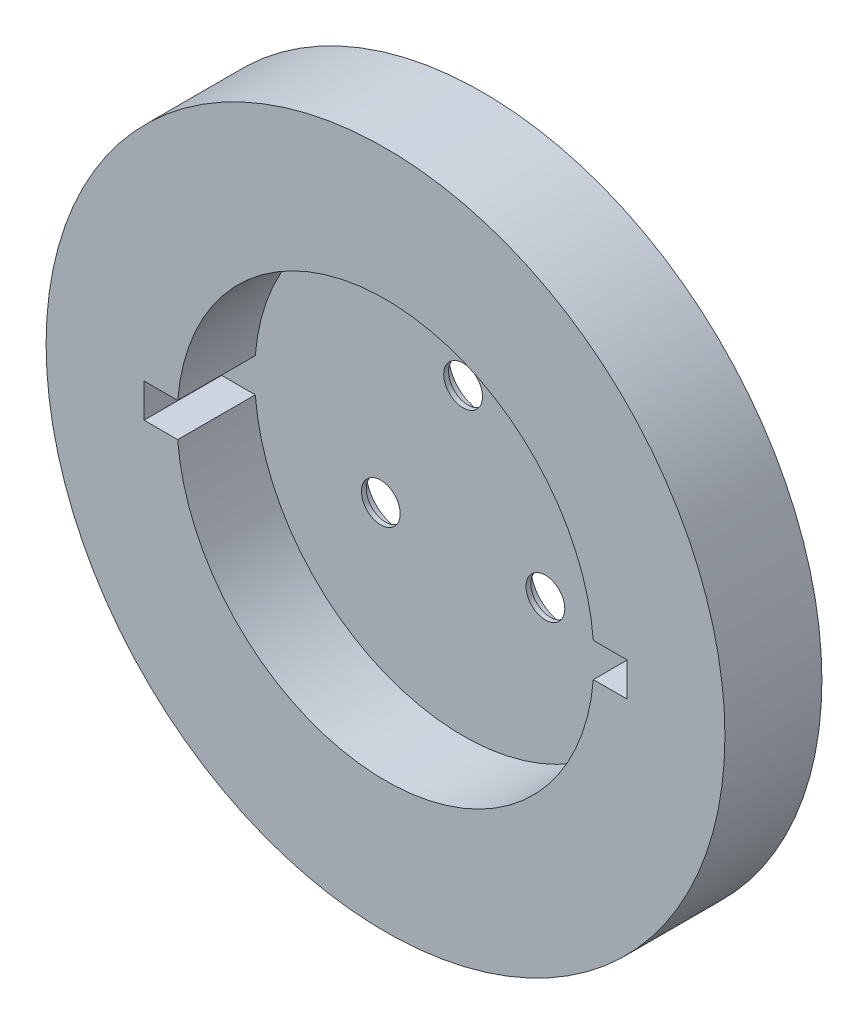
ISO-10303-21;
HEADER;
FILE_DESCRIPTION(('STEP AP214'),'2;1');
FILE_NAME('part.step','',(''),(''),'','','');
FILE_SCHEMA(('AUTOMOTIVE_DESIGN { 1 0 10303 214 1 1 1 1 }'));
ENDSEC;
DATA;
#1=APPLICATION_CONTEXT('core data for automotive mechanical design processes');
#2=APPLICATION_PROTOCOL_DEFINITION('international standard','automotive_design',2000,#1);
#3=PRODUCT_CONTEXT('',#1,'mechanical');
#4=PRODUCT('Part','Part','',(#3));
#5=PRODUCT_RELATED_PRODUCT_CATEGORY('part','',(#4));
#6=PRODUCT_DEFINITION_FORMATION('','',#4);
#7=PRODUCT_DEFINITION_CONTEXT('part definition',#1,'design');
#8=PRODUCT_DEFINITION('design','',#6,#7);
#9=PRODUCT_DEFINITION_SHAPE('','',#8);
#10=(LENGTH_UNIT() NAMED_UNIT(*) SI_UNIT(.MILLI.,.METRE.));
#11=(NAMED_UNIT(*) PLANE_ANGLE_UNIT() SI_UNIT($,.RADIAN.));
#12=(NAMED_UNIT(*) SI_UNIT($,.STERADIAN.) SOLID_ANGLE_UNIT());
#13=UNCERTAINTY_MEASURE_WITH_UNIT(LENGTH_MEASURE(1.E-05),#10,'distance_accuracy_value','');
#14=(GEOMETRIC_REPRESENTATION_CONTEXT(3) GLOBAL_UNCERTAINTY_ASSIGNED_CONTEXT((#13)) GLOBAL_UNIT_ASSIGNED_CONTEXT((#10,
#11,#12)) REPRESENTATION_CONTEXT('',''));
#15=CARTESIAN_POINT('',(0.,0.,0.));
#16=DIRECTION('',(0.,0.,1.));
#17=DIRECTION('',(1.,0.,0.));
#18=AXIS2_PLACEMENT_3D('',#15,#16,#17);
#19=CARTESIAN_POINT('',(0.,0.,10.));
#20=DIRECTION('',(0.,0.,1.));
#21=DIRECTION('',(1.,0.,0.));
#22=AXIS2_PLACEMENT_3D('',#19,#20,#21);
#23=PLANE('',#22);
#24=CARTESIAN_POINT('',(0.,0.,10.));
#25=DIRECTION('',(0.,0.,1.));
#26=DIRECTION('',(1.,0.,0.));
#27=AXIS2_PLACEMENT_3D('',#24,#25,#26);
#28=CIRCLE('',#27,35.);
#29=CARTESIAN_POINT('',(35.,0.,10.));
#30=VERTEX_POINT('',#29);
#31=EDGE_CURVE('E11',#30,#30,#28,.T.);
#32=ORIENTED_EDGE('',*,*,#31,.T.);
#33=EDGE_LOOP('',(#32));
#34=FACE_BOUND('',#33,.T.);
#35=DIRECTION('',(0.,1.,0.));
#36=VECTOR('',#35,1.);
#37=CARTESIAN_POINT('',(24.9,0.,10.));
#38=LINE('',#37,#36);
#39=CARTESIAN_POINT('',(24.9,-1.75,10.));
#40=VERTEX_POINT('',#39);
#41=CARTESIAN_POINT('',(24.9,1.75,10.));
#42=VERTEX_POINT('',#41);
#43=EDGE_CURVE('E145',#40,#42,#38,.T.);
#44=ORIENTED_EDGE('',*,*,#43,.F.);
#45=DIRECTION('',(-1.,0.,0.));
#46=VECTOR('',#45,1.);
#47=CARTESIAN_POINT('',(0.,-1.75,10.));
#48=LINE('',#47,#46);
#49=CARTESIAN_POINT('',(21.4286607140997,-1.75,10.));
#50=VERTEX_POINT('',#49);
#51=EDGE_CURVE('E57',#40,#50,#48,.T.);
#52=ORIENTED_EDGE('',*,*,#51,.T.);
#53=CARTESIAN_POINT('',(0.,0.,10.));
#54=DIRECTION('',(0.,0.,1.));
#55=DIRECTION('',(1.,0.,0.));
#56=AXIS2_PLACEMENT_3D('',#53,#54,#55);
#57=CIRCLE('',#56,21.5);
#58=CARTESIAN_POINT('',(-21.4286607140997,-1.75000000000067,10.));
#59=VERTEX_POINT('',#58);
#60=EDGE_CURVE('E159',#59,#50,#57,.T.);
#61=ORIENTED_EDGE('',*,*,#60,.F.);
#62=DIRECTION('',(1.,-2.43429726580597E-13,0.));
#63=VECTOR('',#62,1.);
#64=CARTESIAN_POINT('',(-4.26002021517478E-13,-1.75000000000589,10.));
#65=LINE('',#64,#63);
#66=CARTESIAN_POINT('',(-24.9,-1.74999999999983,10.));
#67=VERTEX_POINT('',#66);
#68=EDGE_CURVE('E165',#67,#59,#65,.T.);
#69=ORIENTED_EDGE('',*,*,#68,.F.);
#70=DIRECTION('',(4.97617819965918E-13,1.,0.));
#71=VECTOR('',#70,1.);
#72=CARTESIAN_POINT('',(-24.9,1.23906837171513E-11,10.));
#73=LINE('',#72,#71);
#74=CARTESIAN_POINT('',(-24.8999999999991,1.75000000000018,10.));
#75=VERTEX_POINT('',#74);
#76=EDGE_CURVE('E114',#67,#75,#73,.T.);
#77=ORIENTED_EDGE('',*,*,#76,.T.);
#78=DIRECTION('',(1.,-2.44241783661828E-13,0.));
#79=VECTOR('',#78,1.);
#80=CARTESIAN_POINT('',(4.27423121406757E-13,1.74999999999409,10.));
#81=LINE('',#80,#79);
#82=CARTESIAN_POINT('',(-21.4286607140993,1.74999999999937,10.));
#83=VERTEX_POINT('',#82);
#84=EDGE_CURVE('E158',#75,#83,#81,.T.);
#85=ORIENTED_EDGE('',*,*,#84,.T.);
#86=CARTESIAN_POINT('',(21.4286607140997,1.75,10.));
#87=VERTEX_POINT('',#86);
#88=EDGE_CURVE('E154',#87,#83,#57,.T.);
#89=ORIENTED_EDGE('',*,*,#88,.F.);
#90=DIRECTION('',(-1.,0.,0.));
#91=VECTOR('',#90,1.);
#92=CARTESIAN_POINT('',(0.,1.75,10.));
#93=LINE('',#92,#91);
#94=EDGE_CURVE('E150',#42,#87,#93,.T.);
#95=ORIENTED_EDGE('',*,*,#94,.F.);
#96=EDGE_LOOP('',(#44,#52,#61,#69,#77,#85,#89,#95));
#97=FACE_BOUND('',#96,.T.);
#98=ADVANCED_FACE('F39',(#34,#97),#23,.T.);
#99=CARTESIAN_POINT('',(0.,0.,10.));
#100=DIRECTION('',(0.,0.,-1.));
#101=DIRECTION('',(-1.,0.,0.));
#102=AXIS2_PLACEMENT_3D('',#99,#100,#101);
#103=CYLINDRICAL_SURFACE('',#102,35.);
#104=ORIENTED_EDGE('',*,*,#31,.F.);
#105=EDGE_LOOP('',(#104));
#106=FACE_BOUND('',#105,.T.);
#107=CARTESIAN_POINT('',(0.,0.,0.));
#108=DIRECTION('',(0.,0.,1.));
#109=DIRECTION('',(1.,0.,0.));
#110=AXIS2_PLACEMENT_3D('',#107,#108,#109);
#111=CIRCLE('',#110,35.);
#112=CARTESIAN_POINT('',(35.,0.,0.));
#113=VERTEX_POINT('',#112);
#114=EDGE_CURVE('E49',#113,#113,#111,.T.);
#115=ORIENTED_EDGE('',*,*,#114,.T.);
#116=EDGE_LOOP('',(#115));
#117=FACE_BOUND('',#116,.T.);
#118=ADVANCED_FACE('F41',(#106,#117),#103,.T.);
#119=CARTESIAN_POINT('',(0.,0.,0.));
#120=DIRECTION('',(0.,0.,1.));
#121=DIRECTION('',(1.,0.,0.));
#122=AXIS2_PLACEMENT_3D('',#119,#120,#121);
#123=PLANE('',#122);
#124=CARTESIAN_POINT('',(0.,9.8000000000006,0.));
#125=DIRECTION('',(0.,0.,-1.));
#126=DIRECTION('',(-1.,0.,0.));
#127=AXIS2_PLACEMENT_3D('',#124,#125,#126);
#128=CIRCLE('',#127,3.5);
#129=CARTESIAN_POINT('',(-3.5000000000001,9.8000000000006,0.));
#130=VERTEX_POINT('',#129);
#131=EDGE_CURVE('E246',#130,#130,#128,.T.);
#132=ORIENTED_EDGE('',*,*,#131,.F.);
#133=EDGE_LOOP('',(#132));
#134=FACE_BOUND('',#133,.T.);
#135=CARTESIAN_POINT('',(8.48704895708804,-4.90000000000026,0.));
#136=DIRECTION('',(0.,0.,-1.));
#137=DIRECTION('',(-1.,0.,0.));
#138=AXIS2_PLACEMENT_3D('',#135,#136,#137);
#139=CIRCLE('',#138,3.5);
#140=CARTESIAN_POINT('',(4.98704895708804,-4.90000000000026,0.));
#141=VERTEX_POINT('',#140);
#142=EDGE_CURVE('E210',#141,#141,#139,.T.);
#143=ORIENTED_EDGE('',*,*,#142,.F.);
#144=EDGE_LOOP('',(#143));
#145=FACE_BOUND('',#144,.T.);
#146=CARTESIAN_POINT('',(-8.48704895708802,-4.9000000000003,0.));
#147=DIRECTION('',(0.,0.,-1.));
#148=DIRECTION('',(-1.,0.,0.));
#149=AXIS2_PLACEMENT_3D('',#146,#147,#148);
#150=CIRCLE('',#149,3.5);
#151=CARTESIAN_POINT('',(-11.987048957088,-4.9000000000003,0.));
#152=VERTEX_POINT('',#151);
#153=EDGE_CURVE('E199',#152,#152,#150,.T.);
#154=ORIENTED_EDGE('',*,*,#153,.F.);
#155=EDGE_LOOP('',(#154));
#156=FACE_BOUND('',#155,.T.);
#157=ORIENTED_EDGE('',*,*,#114,.F.);
#158=EDGE_LOOP('',(#157));
#159=FACE_BOUND('',#158,.T.);
#160=ADVANCED_FACE('F287',(#134,#145,#156,#159),#123,.F.);
#161=CARTESIAN_POINT('',(0.,-1.75,2.));
#162=DIRECTION('',(0.,1.,0.));
#163=DIRECTION('',(0.,0.,1.));
#164=AXIS2_PLACEMENT_3D('',#161,#162,#163);
#165=PLANE('',#164);
#166=ORIENTED_EDGE('',*,*,#51,.F.);
#167=DIRECTION('',(0.,0.,1.));
#168=VECTOR('',#167,1.);
#169=CARTESIAN_POINT('',(24.9,-1.75,2.));
#170=LINE('',#169,#168);
#171=CARTESIAN_POINT('',(24.9,-1.75,2.));
#172=VERTEX_POINT('',#171);
#173=EDGE_CURVE('E93',#172,#40,#170,.T.);
#174=ORIENTED_EDGE('',*,*,#173,.F.);
#175=DIRECTION('',(-1.,0.,0.));
#176=VECTOR('',#175,1.);
#177=CARTESIAN_POINT('',(0.,-1.75,2.));
#178=LINE('',#177,#176);
#179=CARTESIAN_POINT('',(21.4286607140997,-1.75,2.));
#180=VERTEX_POINT('',#179);
#181=EDGE_CURVE('E63',#172,#180,#178,.T.);
#182=ORIENTED_EDGE('',*,*,#181,.T.);
#183=DIRECTION('',(0.,0.,1.));
#184=VECTOR('',#183,1.);
#185=CARTESIAN_POINT('',(21.4286607140997,-1.75,2.));
#186=LINE('',#185,#184);
#187=EDGE_CURVE('E89',#180,#50,#186,.T.);
#188=ORIENTED_EDGE('',*,*,#187,.T.);
#189=EDGE_LOOP('',(#166,#174,#182,#188));
#190=FACE_BOUND('',#189,.T.);
#191=ADVANCED_FACE('F290',(#190),#165,.T.);
#192=CARTESIAN_POINT('',(0.,0.,2.));
#193=DIRECTION('',(0.,0.,1.));
#194=DIRECTION('',(1.,0.,0.));
#195=AXIS2_PLACEMENT_3D('',#192,#193,#194);
#196=CYLINDRICAL_SURFACE('',#195,21.5);
#197=ORIENTED_EDGE('',*,*,#60,.T.);
#198=ORIENTED_EDGE('',*,*,#187,.F.);
#199=CARTESIAN_POINT('',(0.,0.,2.));
#200=DIRECTION('',(0.,0.,1.));
#201=DIRECTION('',(1.,0.,0.));
#202=AXIS2_PLACEMENT_3D('',#199,#200,#201);
#203=CIRCLE('',#202,21.5);
#204=CARTESIAN_POINT('',(-21.4286607140997,-1.75000000000067,2.));
#205=VERTEX_POINT('',#204);
#206=EDGE_CURVE('E136',#205,#180,#203,.T.);
#207=ORIENTED_EDGE('',*,*,#206,.F.);
#208=DIRECTION('',(0.,0.,1.));
#209=VECTOR('',#208,1.);
#210=CARTESIAN_POINT('',(-21.4286607140997,-1.75000000000067,2.));
#211=LINE('',#210,#209);
#212=EDGE_CURVE('E120',#205,#59,#211,.T.);
#213=ORIENTED_EDGE('',*,*,#212,.T.);
#214=EDGE_LOOP('',(#197,#198,#207,#213));
#215=FACE_BOUND('',#214,.T.);
#216=ADVANCED_FACE('F308',(#215),#196,.F.);
#217=CARTESIAN_POINT('',(-4.26002021517478E-13,-1.75000000000589,2.));
#218=DIRECTION('',(-2.43429726580597E-13,-1.,0.));
#219=DIRECTION('',(1.,-2.43429726580597E-13,0.));
#220=AXIS2_PLACEMENT_3D('',#217,#218,#219);
#221=PLANE('',#220);
#222=ORIENTED_EDGE('',*,*,#68,.T.);
#223=ORIENTED_EDGE('',*,*,#212,.F.);
#224=DIRECTION('',(1.,-2.43429726580597E-13,0.));
#225=VECTOR('',#224,1.);
#226=CARTESIAN_POINT('',(-4.26002021517478E-13,-1.75000000000589,2.));
#227=LINE('',#226,#225);
#228=CARTESIAN_POINT('',(-24.9,-1.74999999999983,2.));
#229=VERTEX_POINT('',#228);
#230=EDGE_CURVE('E128',#229,#205,#227,.T.);
#231=ORIENTED_EDGE('',*,*,#230,.F.);
#232=DIRECTION('',(0.,0.,1.));
#233=VECTOR('',#232,1.);
#234=CARTESIAN_POINT('',(-24.9,-1.74999999999983,2.));
#235=LINE('',#234,#233);
#236=EDGE_CURVE('E108',#229,#67,#235,.T.);
#237=ORIENTED_EDGE('',*,*,#236,.T.);
#238=EDGE_LOOP('',(#222,#223,#231,#237));
#239=FACE_BOUND('',#238,.T.);
#240=ADVANCED_FACE('F134',(#239),#221,.F.);
#241=CARTESIAN_POINT('',(-24.9,1.23906837171513E-11,2.));
#242=DIRECTION('',(1.,-4.97617819965918E-13,0.));
#243=DIRECTION('',(4.97617819965918E-13,1.,0.));
#244=AXIS2_PLACEMENT_3D('',#241,#242,#243);
#245=PLANE('',#244);
#246=ORIENTED_EDGE('',*,*,#76,.F.);
#247=ORIENTED_EDGE('',*,*,#236,.F.);
#248=DIRECTION('',(4.97617819965918E-13,1.,0.));
#249=VECTOR('',#248,1.);
#250=CARTESIAN_POINT('',(-24.9,1.23906837171513E-11,2.));
#251=LINE('',#250,#249);
#252=CARTESIAN_POINT('',(-24.8999999999991,1.75000000000018,2.));
#253=VERTEX_POINT('',#252);
#254=EDGE_CURVE('E111',#229,#253,#251,.T.);
#255=ORIENTED_EDGE('',*,*,#254,.T.);
#256=DIRECTION('',(0.,0.,1.));
#257=VECTOR('',#256,1.);
#258=CARTESIAN_POINT('',(-24.8999999999991,1.75000000000018,2.));
#259=LINE('',#258,#257);
#260=EDGE_CURVE('E121',#253,#75,#259,.T.);
#261=ORIENTED_EDGE('',*,*,#260,.T.);
#262=EDGE_LOOP('',(#246,#247,#255,#261));
#263=FACE_BOUND('',#262,.T.);
#264=ADVANCED_FACE('F110',(#263),#245,.T.);
#265=CARTESIAN_POINT('',(4.27423121406757E-13,1.74999999999409,2.));
#266=DIRECTION('',(-2.44241783661828E-13,-1.,0.));
#267=DIRECTION('',(1.,-2.44241783661828E-13,0.));
#268=AXIS2_PLACEMENT_3D('',#265,#266,#267);
#269=PLANE('',#268);
#270=ORIENTED_EDGE('',*,*,#84,.F.);
#271=ORIENTED_EDGE('',*,*,#260,.F.);
#272=DIRECTION('',(1.,-2.44241783661828E-13,0.));
#273=VECTOR('',#272,1.);
#274=CARTESIAN_POINT('',(4.27423121406757E-13,1.74999999999409,2.));
#275=LINE('',#274,#273);
#276=CARTESIAN_POINT('',(-21.4286607140993,1.74999999999937,2.));
#277=VERTEX_POINT('',#276);
#278=EDGE_CURVE('E131',#253,#277,#275,.T.);
#279=ORIENTED_EDGE('',*,*,#278,.T.);
#280=DIRECTION('',(0.,0.,1.));
#281=VECTOR('',#280,1.);
#282=CARTESIAN_POINT('',(-21.4286607140993,1.74999999999937,2.));
#283=LINE('',#282,#281);
#284=EDGE_CURVE('E174',#277,#83,#283,.T.);
#285=ORIENTED_EDGE('',*,*,#284,.T.);
#286=EDGE_LOOP('',(#270,#271,#279,#285));
#287=FACE_BOUND('',#286,.T.);
#288=ADVANCED_FACE('F228',(#287),#269,.T.);
#289=ORIENTED_EDGE('',*,*,#88,.T.);
#290=ORIENTED_EDGE('',*,*,#284,.F.);
#291=CARTESIAN_POINT('',(21.4286607140997,1.75,2.));
#292=VERTEX_POINT('',#291);
#293=EDGE_CURVE('E140',#292,#277,#203,.T.);
#294=ORIENTED_EDGE('',*,*,#293,.F.);
#295=DIRECTION('',(0.,0.,1.));
#296=VECTOR('',#295,1.);
#297=CARTESIAN_POINT('',(21.4286607140997,1.75,2.));
#298=LINE('',#297,#296);
#299=EDGE_CURVE('E177',#292,#87,#298,.T.);
#300=ORIENTED_EDGE('',*,*,#299,.T.);
#301=EDGE_LOOP('',(#289,#290,#294,#300));
#302=FACE_BOUND('',#301,.T.);
#303=ADVANCED_FACE('F231',(#302),#196,.F.);
#304=CARTESIAN_POINT('',(0.,1.75,2.));
#305=DIRECTION('',(0.,1.,0.));
#306=DIRECTION('',(0.,0.,1.));
#307=AXIS2_PLACEMENT_3D('',#304,#305,#306);
#308=PLANE('',#307);
#309=ORIENTED_EDGE('',*,*,#94,.T.);
#310=ORIENTED_EDGE('',*,*,#299,.F.);
#311=DIRECTION('',(-1.,0.,0.));
#312=VECTOR('',#311,1.);
#313=CARTESIAN_POINT('',(0.,1.75,2.));
#314=LINE('',#313,#312);
#315=CARTESIAN_POINT('',(24.9,1.75,2.));
#316=VERTEX_POINT('',#315);
#317=EDGE_CURVE('E220',#316,#292,#314,.T.);
#318=ORIENTED_EDGE('',*,*,#317,.F.);
#319=DIRECTION('',(0.,0.,1.));
#320=VECTOR('',#319,1.);
#321=CARTESIAN_POINT('',(24.9,1.75,2.));
#322=LINE('',#321,#320);
#323=EDGE_CURVE('E180',#316,#42,#322,.T.);
#324=ORIENTED_EDGE('',*,*,#323,.T.);
#325=EDGE_LOOP('',(#309,#310,#318,#324));
#326=FACE_BOUND('',#325,.T.);
#327=ADVANCED_FACE('F236',(#326),#308,.F.);
#328=CARTESIAN_POINT('',(24.9,0.,2.));
#329=DIRECTION('',(1.,0.,0.));
#330=DIRECTION('',(0.,0.,-1.));
#331=AXIS2_PLACEMENT_3D('',#328,#329,#330);
#332=PLANE('',#331);
#333=ORIENTED_EDGE('',*,*,#43,.T.);
#334=ORIENTED_EDGE('',*,*,#323,.F.);
#335=DIRECTION('',(0.,1.,0.));
#336=VECTOR('',#335,1.);
#337=CARTESIAN_POINT('',(24.9,0.,2.));
#338=LINE('',#337,#336);
#339=EDGE_CURVE('E216',#172,#316,#338,.T.);
#340=ORIENTED_EDGE('',*,*,#339,.F.);
#341=ORIENTED_EDGE('',*,*,#173,.T.);
#342=EDGE_LOOP('',(#333,#334,#340,#341));
#343=FACE_BOUND('',#342,.T.);
#344=ADVANCED_FACE('F309',(#343),#332,.F.);
#345=CARTESIAN_POINT('',(0.,0.,2.));
#346=DIRECTION('',(0.,0.,1.));
#347=DIRECTION('',(1.,0.,0.));
#348=AXIS2_PLACEMENT_3D('',#345,#346,#347);
#349=PLANE('',#348);
#350=CARTESIAN_POINT('',(0.,9.8000000000006,2.));
#351=DIRECTION('',(0.,0.,1.));
#352=DIRECTION('',(1.,0.,0.));
#353=AXIS2_PLACEMENT_3D('',#350,#351,#352);
#354=CIRCLE('',#353,2.);
#355=CARTESIAN_POINT('',(1.99999999999991,9.8000000000006,2.));
#356=VERTEX_POINT('',#355);
#357=EDGE_CURVE('E43',#356,#356,#354,.T.);
#358=ORIENTED_EDGE('',*,*,#357,.F.);
#359=EDGE_LOOP('',(#358));
#360=FACE_BOUND('',#359,.T.);
#361=CARTESIAN_POINT('',(8.48704895708744,-4.90000000000058,2.));
#362=DIRECTION('',(0.,0.,1.));
#363=DIRECTION('',(1.,0.,0.));
#364=AXIS2_PLACEMENT_3D('',#361,#362,#363);
#365=CIRCLE('',#364,2.00000000000079);
#366=CARTESIAN_POINT('',(10.4870489570882,-4.90000000000058,2.));
#367=VERTEX_POINT('',#366);
#368=EDGE_CURVE('E191',#367,#367,#365,.T.);
#369=ORIENTED_EDGE('',*,*,#368,.F.);
#370=EDGE_LOOP('',(#369));
#371=FACE_BOUND('',#370,.T.);
#372=CARTESIAN_POINT('',(-8.4870489570886,-4.90000000000001,2.));
#373=DIRECTION('',(0.,0.,1.));
#374=DIRECTION('',(1.,0.,0.));
#375=AXIS2_PLACEMENT_3D('',#372,#373,#374);
#376=CIRCLE('',#375,2.00000000000054);
#377=CARTESIAN_POINT('',(-6.48704895708806,-4.90000000000001,2.));
#378=VERTEX_POINT('',#377);
#379=EDGE_CURVE('E188',#378,#378,#376,.T.);
#380=ORIENTED_EDGE('',*,*,#379,.F.);
#381=EDGE_LOOP('',(#380));
#382=FACE_BOUND('',#381,.T.);
#383=ORIENTED_EDGE('',*,*,#181,.F.);
#384=ORIENTED_EDGE('',*,*,#339,.T.);
#385=ORIENTED_EDGE('',*,*,#317,.T.);
#386=ORIENTED_EDGE('',*,*,#293,.T.);
#387=ORIENTED_EDGE('',*,*,#278,.F.);
#388=ORIENTED_EDGE('',*,*,#254,.F.);
#389=ORIENTED_EDGE('',*,*,#230,.T.);
#390=ORIENTED_EDGE('',*,*,#206,.T.);
#391=EDGE_LOOP('',(#383,#384,#385,#386,#387,#388,#389,#390));
#392=FACE_BOUND('',#391,.T.);
#393=ADVANCED_FACE('F126',(#360,#371,#382,#392),#349,.T.);
#394=CARTESIAN_POINT('',(-8.48704895708802,-4.9000000000003,1.5));
#395=DIRECTION('',(0.,0.,-1.));
#396=DIRECTION('',(-1.,0.,0.));
#397=AXIS2_PLACEMENT_3D('',#394,#395,#396);
#398=CYLINDRICAL_SURFACE('',#397,3.5);
#399=CARTESIAN_POINT('',(-8.48704895708802,-4.9000000000003,1.5));
#400=DIRECTION('',(0.,0.,-1.));
#401=DIRECTION('',(-1.,0.,0.));
#402=AXIS2_PLACEMENT_3D('',#399,#400,#401);
#403=CIRCLE('',#402,3.5);
#404=CARTESIAN_POINT('',(-11.987048957088,-4.9000000000003,1.5));
#405=VERTEX_POINT('',#404);
#406=EDGE_CURVE('E204',#405,#405,#403,.T.);
#407=ORIENTED_EDGE('',*,*,#406,.F.);
#408=EDGE_LOOP('',(#407));
#409=FACE_BOUND('',#408,.T.);
#410=ORIENTED_EDGE('',*,*,#153,.T.);
#411=EDGE_LOOP('',(#410));
#412=FACE_BOUND('',#411,.T.);
#413=ADVANCED_FACE('F325',(#409,#412),#398,.F.);
#414=CARTESIAN_POINT('',(0.,0.,1.5));
#415=DIRECTION('',(0.,0.,-1.));
#416=DIRECTION('',(-1.,0.,0.));
#417=AXIS2_PLACEMENT_3D('',#414,#415,#416);
#418=PLANE('',#417);
#419=CARTESIAN_POINT('',(-8.4870489570886,-4.90000000000001,1.5));
#420=DIRECTION('',(0.,0.,-1.));
#421=DIRECTION('',(-1.,0.,0.));
#422=AXIS2_PLACEMENT_3D('',#419,#420,#421);
#423=CIRCLE('',#422,2.00000000000054);
#424=CARTESIAN_POINT('',(-10.4870489570891,-4.90000000000001,1.5));
#425=VERTEX_POINT('',#424);
#426=EDGE_CURVE('E259',#425,#425,#423,.T.);
#427=ORIENTED_EDGE('',*,*,#426,.F.);
#428=EDGE_LOOP('',(#427));
#429=FACE_BOUND('',#428,.T.);
#430=ORIENTED_EDGE('',*,*,#406,.T.);
#431=EDGE_LOOP('',(#430));
#432=FACE_BOUND('',#431,.T.);
#433=ADVANCED_FACE('F329',(#429,#432),#418,.T.);
#434=CARTESIAN_POINT('',(8.48704895708804,-4.90000000000026,1.5));
#435=DIRECTION('',(0.,0.,-1.));
#436=DIRECTION('',(-1.,0.,0.));
#437=AXIS2_PLACEMENT_3D('',#434,#435,#436);
#438=CYLINDRICAL_SURFACE('',#437,3.5);
#439=CARTESIAN_POINT('',(8.48704895708804,-4.90000000000026,1.5));
#440=DIRECTION('',(0.,0.,-1.));
#441=DIRECTION('',(-1.,0.,0.));
#442=AXIS2_PLACEMENT_3D('',#439,#440,#441);
#443=CIRCLE('',#442,3.5);
#444=CARTESIAN_POINT('',(4.98704895708804,-4.90000000000026,1.5));
#445=VERTEX_POINT('',#444);
#446=EDGE_CURVE('E250',#445,#445,#443,.T.);
#447=ORIENTED_EDGE('',*,*,#446,.F.);
#448=EDGE_LOOP('',(#447));
#449=FACE_BOUND('',#448,.T.);
#450=ORIENTED_EDGE('',*,*,#142,.T.);
#451=EDGE_LOOP('',(#450));
#452=FACE_BOUND('',#451,.T.);
#453=ADVANCED_FACE('F333',(#449,#452),#438,.F.);
#454=CARTESIAN_POINT('',(0.,0.,1.5));
#455=DIRECTION('',(0.,0.,-1.));
#456=DIRECTION('',(-1.,0.,0.));
#457=AXIS2_PLACEMENT_3D('',#454,#455,#456);
#458=PLANE('',#457);
#459=CARTESIAN_POINT('',(8.48704895708744,-4.90000000000058,1.5));
#460=DIRECTION('',(0.,0.,-1.));
#461=DIRECTION('',(-1.,0.,0.));
#462=AXIS2_PLACEMENT_3D('',#459,#460,#461);
#463=CIRCLE('',#462,2.00000000000079);
#464=CARTESIAN_POINT('',(6.48704895708665,-4.90000000000058,1.5));
#465=VERTEX_POINT('',#464);
#466=EDGE_CURVE('E263',#465,#465,#463,.T.);
#467=ORIENTED_EDGE('',*,*,#466,.F.);
#468=EDGE_LOOP('',(#467));
#469=FACE_BOUND('',#468,.T.);
#470=ORIENTED_EDGE('',*,*,#446,.T.);
#471=EDGE_LOOP('',(#470));
#472=FACE_BOUND('',#471,.T.);
#473=ADVANCED_FACE('F283',(#469,#472),#458,.T.);
#474=CARTESIAN_POINT('',(0.,9.8000000000006,1.5));
#475=DIRECTION('',(0.,0.,-1.));
#476=DIRECTION('',(-1.,0.,0.));
#477=AXIS2_PLACEMENT_3D('',#474,#475,#476);
#478=CYLINDRICAL_SURFACE('',#477,3.5);
#479=CARTESIAN_POINT('',(0.,9.8000000000006,1.5));
#480=DIRECTION('',(0.,0.,-1.));
#481=DIRECTION('',(-1.,0.,0.));
#482=AXIS2_PLACEMENT_3D('',#479,#480,#481);
#483=CIRCLE('',#482,3.5);
#484=CARTESIAN_POINT('',(-3.5000000000001,9.8000000000006,1.5));
#485=VERTEX_POINT('',#484);
#486=EDGE_CURVE('E146',#485,#485,#483,.T.);
#487=ORIENTED_EDGE('',*,*,#486,.F.);
#488=EDGE_LOOP('',(#487));
#489=FACE_BOUND('',#488,.T.);
#490=ORIENTED_EDGE('',*,*,#131,.T.);
#491=EDGE_LOOP('',(#490));
#492=FACE_BOUND('',#491,.T.);
#493=ADVANCED_FACE('F277',(#489,#492),#478,.F.);
#494=CARTESIAN_POINT('',(0.,0.,1.5));
#495=DIRECTION('',(0.,0.,-1.));
#496=DIRECTION('',(-1.,0.,0.));
#497=AXIS2_PLACEMENT_3D('',#494,#495,#496);
#498=PLANE('',#497);
#499=CARTESIAN_POINT('',(0.,9.8000000000006,1.5));
#500=DIRECTION('',(0.,0.,-1.));
#501=DIRECTION('',(-1.,0.,0.));
#502=AXIS2_PLACEMENT_3D('',#499,#500,#501);
#503=CIRCLE('',#502,2.);
#504=CARTESIAN_POINT('',(-2.00000000000009,9.8000000000006,1.5));
#505=VERTEX_POINT('',#504);
#506=EDGE_CURVE('E192',#505,#505,#503,.T.);
#507=ORIENTED_EDGE('',*,*,#506,.F.);
#508=EDGE_LOOP('',(#507));
#509=FACE_BOUND('',#508,.T.);
#510=ORIENTED_EDGE('',*,*,#486,.T.);
#511=EDGE_LOOP('',(#510));
#512=FACE_BOUND('',#511,.T.);
#513=ADVANCED_FACE('F273',(#509,#512),#498,.T.);
#514=CARTESIAN_POINT('',(-8.4870489570886,-4.90000000000001,10.));
#515=DIRECTION('',(0.,0.,-1.));
#516=DIRECTION('',(-1.,0.,0.));
#517=AXIS2_PLACEMENT_3D('',#514,#515,#516);
#518=CYLINDRICAL_SURFACE('',#517,2.00000000000054);
#519=ORIENTED_EDGE('',*,*,#379,.T.);
#520=EDGE_LOOP('',(#519));
#521=FACE_BOUND('',#520,.T.);
#522=ORIENTED_EDGE('',*,*,#426,.T.);
#523=EDGE_LOOP('',(#522));
#524=FACE_BOUND('',#523,.T.);
#525=ADVANCED_FACE('F276',(#521,#524),#518,.F.);
#526=CARTESIAN_POINT('',(8.48704895708744,-4.90000000000058,10.));
#527=DIRECTION('',(0.,0.,-1.));
#528=DIRECTION('',(-1.,0.,0.));
#529=AXIS2_PLACEMENT_3D('',#526,#527,#528);
#530=CYLINDRICAL_SURFACE('',#529,2.00000000000079);
#531=ORIENTED_EDGE('',*,*,#368,.T.);
#532=EDGE_LOOP('',(#531));
#533=FACE_BOUND('',#532,.T.);
#534=ORIENTED_EDGE('',*,*,#466,.T.);
#535=EDGE_LOOP('',(#534));
#536=FACE_BOUND('',#535,.T.);
#537=ADVANCED_FACE('F343',(#533,#536),#530,.F.);
#538=CARTESIAN_POINT('',(0.,9.8000000000006,10.));
#539=DIRECTION('',(0.,0.,-1.));
#540=DIRECTION('',(-1.,0.,0.));
#541=AXIS2_PLACEMENT_3D('',#538,#539,#540);
#542=CYLINDRICAL_SURFACE('',#541,2.);
#543=ORIENTED_EDGE('',*,*,#357,.T.);
#544=EDGE_LOOP('',(#543));
#545=FACE_BOUND('',#544,.T.);
#546=ORIENTED_EDGE('',*,*,#506,.T.);
#547=EDGE_LOOP('',(#546));
#548=FACE_BOUND('',#547,.T.);
#549=ADVANCED_FACE('F271',(#545,#548),#542,.F.);
#550=CLOSED_SHELL('',(#98,#118,#160,#191,#216,#240,#264,#288,#303,#327,#344,#393,#413,#433,#453,
#473,#493,#513,#525,#537,#549));
#551=MANIFOLD_SOLID_BREP('B2',#550);
#552=ADVANCED_BREP_SHAPE_REPRESENTATION('',(#18,#551),#14);
#553=SHAPE_DEFINITION_REPRESENTATION(#9,#552);
ENDSEC;
END-ISO-10303-21;
